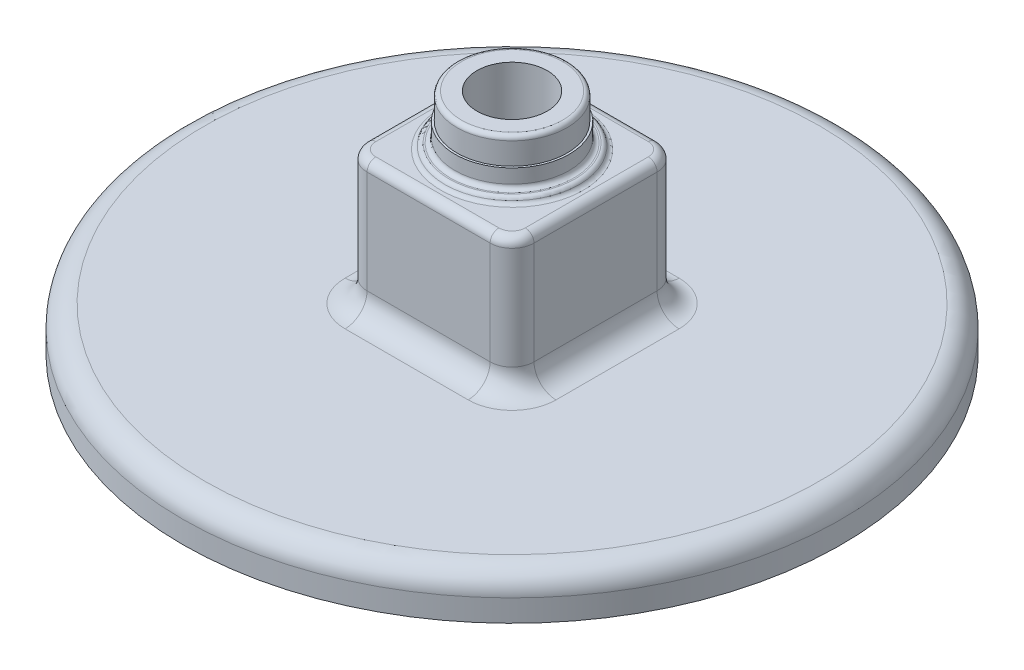
ISO-10303-21;
HEADER;
FILE_DESCRIPTION(('STEP AP214'),'2;1');
FILE_NAME('part.step','',(''),(''),'','','');
FILE_SCHEMA(('AUTOMOTIVE_DESIGN { 1 0 10303 214 1 1 1 1 }'));
ENDSEC;
DATA;
#1=APPLICATION_CONTEXT('core data for automotive mechanical design processes');
#2=APPLICATION_PROTOCOL_DEFINITION('international standard','automotive_design',2000,#1);
#3=PRODUCT_CONTEXT('',#1,'mechanical');
#4=PRODUCT('Part','Part','',(#3));
#5=PRODUCT_RELATED_PRODUCT_CATEGORY('part','',(#4));
#6=PRODUCT_DEFINITION_FORMATION('','',#4);
#7=PRODUCT_DEFINITION_CONTEXT('part definition',#1,'design');
#8=PRODUCT_DEFINITION('design','',#6,#7);
#9=PRODUCT_DEFINITION_SHAPE('','',#8);
#10=(LENGTH_UNIT() NAMED_UNIT(*) SI_UNIT(.MILLI.,.METRE.));
#11=(NAMED_UNIT(*) PLANE_ANGLE_UNIT() SI_UNIT($,.RADIAN.));
#12=(NAMED_UNIT(*) SI_UNIT($,.STERADIAN.) SOLID_ANGLE_UNIT());
#13=UNCERTAINTY_MEASURE_WITH_UNIT(LENGTH_MEASURE(1.E-05),#10,'distance_accuracy_value','');
#14=(GEOMETRIC_REPRESENTATION_CONTEXT(3) GLOBAL_UNCERTAINTY_ASSIGNED_CONTEXT((#13)) GLOBAL_UNIT_ASSIGNED_CONTEXT((#10,
#11,#12)) REPRESENTATION_CONTEXT('',''));
#15=CARTESIAN_POINT('',(0.,0.,0.));
#16=DIRECTION('',(0.,0.,1.));
#17=DIRECTION('',(1.,0.,0.));
#18=AXIS2_PLACEMENT_3D('',#15,#16,#17);
#19=CARTESIAN_POINT('',(19.,40.4,19.));
#20=DIRECTION('',(-1.,0.,0.));
#21=DIRECTION('',(0.,0.,1.));
#22=AXIS2_PLACEMENT_3D('',#19,#20,#21);
#23=PLANE('',#22);
#24=DIRECTION('',(0.,-1.,0.));
#25=VECTOR('',#24,1.);
#26=CARTESIAN_POINT('',(19.,40.4,-14.));
#27=LINE('',#26,#25);
#28=CARTESIAN_POINT('',(19.,15.,-14.));
#29=VERTEX_POINT('',#28);
#30=CARTESIAN_POINT('',(19.,38.4,-14.));
#31=VERTEX_POINT('',#30);
#32=EDGE_CURVE('E482',#29,#31,#27,.F.);
#33=ORIENTED_EDGE('',*,*,#32,.T.);
#34=DIRECTION('',(0.,0.,-1.));
#35=VECTOR('',#34,1.);
#36=CARTESIAN_POINT('',(19.,38.4,19.));
#37=LINE('',#36,#35);
#38=CARTESIAN_POINT('',(19.,38.4,14.));
#39=VERTEX_POINT('',#38);
#40=EDGE_CURVE('E266',#31,#39,#37,.F.);
#41=ORIENTED_EDGE('',*,*,#40,.T.);
#42=DIRECTION('',(0.,-1.,0.));
#43=VECTOR('',#42,1.);
#44=CARTESIAN_POINT('',(19.,40.4,14.));
#45=LINE('',#44,#43);
#46=CARTESIAN_POINT('',(19.,15.,14.));
#47=VERTEX_POINT('',#46);
#48=EDGE_CURVE('E480',#39,#47,#45,.T.);
#49=ORIENTED_EDGE('',*,*,#48,.T.);
#50=DIRECTION('',(0.,0.,-1.));
#51=VECTOR('',#50,1.);
#52=CARTESIAN_POINT('',(19.,15.,19.));
#53=LINE('',#52,#51);
#54=EDGE_CURVE('E217',#47,#29,#53,.T.);
#55=ORIENTED_EDGE('',*,*,#54,.T.);
#56=EDGE_LOOP('',(#33,#41,#49,#55));
#57=FACE_BOUND('',#56,.T.);
#58=ADVANCED_FACE('F40',(#57),#23,.F.);
#59=CARTESIAN_POINT('',(-19.,40.4,-19.));
#60=DIRECTION('',(0.,0.,1.));
#61=DIRECTION('',(1.,0.,0.));
#62=AXIS2_PLACEMENT_3D('',#59,#60,#61);
#63=PLANE('',#62);
#64=DIRECTION('',(0.,-1.,0.));
#65=VECTOR('',#64,1.);
#66=CARTESIAN_POINT('',(-14.,40.4,-19.));
#67=LINE('',#66,#65);
#68=CARTESIAN_POINT('',(-14.,15.,-19.));
#69=VERTEX_POINT('',#68);
#70=CARTESIAN_POINT('',(-14.,38.4,-19.));
#71=VERTEX_POINT('',#70);
#72=EDGE_CURVE('E477',#69,#71,#67,.F.);
#73=ORIENTED_EDGE('',*,*,#72,.T.);
#74=DIRECTION('',(-1.,0.,0.));
#75=VECTOR('',#74,1.);
#76=CARTESIAN_POINT('',(-19.,38.4,-19.));
#77=LINE('',#76,#75);
#78=CARTESIAN_POINT('',(14.,38.4,-19.));
#79=VERTEX_POINT('',#78);
#80=EDGE_CURVE('E63',#71,#79,#77,.F.);
#81=ORIENTED_EDGE('',*,*,#80,.T.);
#82=DIRECTION('',(0.,-1.,0.));
#83=VECTOR('',#82,1.);
#84=CARTESIAN_POINT('',(14.,40.4,-19.));
#85=LINE('',#84,#83);
#86=CARTESIAN_POINT('',(14.,15.,-19.));
#87=VERTEX_POINT('',#86);
#88=EDGE_CURVE('E460',#79,#87,#85,.T.);
#89=ORIENTED_EDGE('',*,*,#88,.T.);
#90=DIRECTION('',(-1.,0.,0.));
#91=VECTOR('',#90,1.);
#92=CARTESIAN_POINT('',(-19.,15.,-19.));
#93=LINE('',#92,#91);
#94=EDGE_CURVE('E214',#87,#69,#93,.T.);
#95=ORIENTED_EDGE('',*,*,#94,.T.);
#96=EDGE_LOOP('',(#73,#81,#89,#95));
#97=FACE_BOUND('',#96,.T.);
#98=ADVANCED_FACE('F317',(#97),#63,.F.);
#99=CARTESIAN_POINT('',(-19.,40.4,19.));
#100=DIRECTION('',(1.,0.,0.));
#101=DIRECTION('',(0.,0.,-1.));
#102=AXIS2_PLACEMENT_3D('',#99,#100,#101);
#103=PLANE('',#102);
#104=DIRECTION('',(0.,-1.,0.));
#105=VECTOR('',#104,1.);
#106=CARTESIAN_POINT('',(-19.,40.4,14.));
#107=LINE('',#106,#105);
#108=CARTESIAN_POINT('',(-19.,15.,14.));
#109=VERTEX_POINT('',#108);
#110=CARTESIAN_POINT('',(-19.,38.4,14.));
#111=VERTEX_POINT('',#110);
#112=EDGE_CURVE('E455',#109,#111,#107,.F.);
#113=ORIENTED_EDGE('',*,*,#112,.T.);
#114=DIRECTION('',(0.,0.,1.));
#115=VECTOR('',#114,1.);
#116=CARTESIAN_POINT('',(-19.,38.4,19.));
#117=LINE('',#116,#115);
#118=CARTESIAN_POINT('',(-19.,38.4,-14.));
#119=VERTEX_POINT('',#118);
#120=EDGE_CURVE('E260',#111,#119,#117,.F.);
#121=ORIENTED_EDGE('',*,*,#120,.T.);
#122=DIRECTION('',(0.,-1.,0.));
#123=VECTOR('',#122,1.);
#124=CARTESIAN_POINT('',(-19.,40.4,-14.));
#125=LINE('',#124,#123);
#126=CARTESIAN_POINT('',(-19.,15.,-14.));
#127=VERTEX_POINT('',#126);
#128=EDGE_CURVE('E461',#119,#127,#125,.T.);
#129=ORIENTED_EDGE('',*,*,#128,.T.);
#130=DIRECTION('',(0.,0.,1.));
#131=VECTOR('',#130,1.);
#132=CARTESIAN_POINT('',(-19.,15.,19.));
#133=LINE('',#132,#131);
#134=EDGE_CURVE('E209',#127,#109,#133,.T.);
#135=ORIENTED_EDGE('',*,*,#134,.T.);
#136=EDGE_LOOP('',(#113,#121,#129,#135));
#137=FACE_BOUND('',#136,.T.);
#138=ADVANCED_FACE('F323',(#137),#103,.F.);
#139=CARTESIAN_POINT('',(-19.,40.4,19.));
#140=DIRECTION('',(0.,0.,-1.));
#141=DIRECTION('',(-1.,0.,0.));
#142=AXIS2_PLACEMENT_3D('',#139,#140,#141);
#143=PLANE('',#142);
#144=DIRECTION('',(0.,-1.,0.));
#145=VECTOR('',#144,1.);
#146=CARTESIAN_POINT('',(14.,40.4,19.));
#147=LINE('',#146,#145);
#148=CARTESIAN_POINT('',(14.,15.,19.));
#149=VERTEX_POINT('',#148);
#150=CARTESIAN_POINT('',(14.,38.4,19.));
#151=VERTEX_POINT('',#150);
#152=EDGE_CURVE('E500',#149,#151,#147,.F.);
#153=ORIENTED_EDGE('',*,*,#152,.T.);
#154=DIRECTION('',(1.,0.,0.));
#155=VECTOR('',#154,1.);
#156=CARTESIAN_POINT('',(-19.,38.4,19.));
#157=LINE('',#156,#155);
#158=CARTESIAN_POINT('',(-14.,38.4,19.));
#159=VERTEX_POINT('',#158);
#160=EDGE_CURVE('E256',#151,#159,#157,.F.);
#161=ORIENTED_EDGE('',*,*,#160,.T.);
#162=DIRECTION('',(0.,-1.,0.));
#163=VECTOR('',#162,1.);
#164=CARTESIAN_POINT('',(-14.,40.4,19.));
#165=LINE('',#164,#163);
#166=CARTESIAN_POINT('',(-14.,15.,19.));
#167=VERTEX_POINT('',#166);
#168=EDGE_CURVE('E504',#159,#167,#165,.T.);
#169=ORIENTED_EDGE('',*,*,#168,.T.);
#170=DIRECTION('',(1.,0.,0.));
#171=VECTOR('',#170,1.);
#172=CARTESIAN_POINT('',(-19.,15.,19.));
#173=LINE('',#172,#171);
#174=EDGE_CURVE('E204',#167,#149,#173,.T.);
#175=ORIENTED_EDGE('',*,*,#174,.T.);
#176=EDGE_LOOP('',(#153,#161,#169,#175));
#177=FACE_BOUND('',#176,.T.);
#178=ADVANCED_FACE('F442',(#177),#143,.F.);
#179=CARTESIAN_POINT('',(0.,40.4,0.));
#180=DIRECTION('',(0.,-1.,0.));
#181=DIRECTION('',(0.,0.,-1.));
#182=AXIS2_PLACEMENT_3D('',#179,#180,#181);
#183=PLANE('',#182);
#184=CARTESIAN_POINT('',(0.,40.4,0.));
#185=DIRECTION('',(0.,-1.,0.));
#186=DIRECTION('',(0.,0.,-1.));
#187=AXIS2_PLACEMENT_3D('',#184,#185,#186);
#188=CIRCLE('',#187,16.2);
#189=CARTESIAN_POINT('',(0.,40.4,-16.2));
#190=VERTEX_POINT('',#189);
#191=EDGE_CURVE('E301',#190,#190,#188,.T.);
#192=ORIENTED_EDGE('',*,*,#191,.T.);
#193=EDGE_LOOP('',(#192));
#194=FACE_BOUND('',#193,.T.);
#195=DIRECTION('',(1.,0.,0.));
#196=VECTOR('',#195,1.);
#197=CARTESIAN_POINT('',(0.,40.4,17.));
#198=LINE('',#197,#196);
#199=CARTESIAN_POINT('',(-14.,40.4,17.));
#200=VERTEX_POINT('',#199);
#201=CARTESIAN_POINT('',(14.,40.4,17.));
#202=VERTEX_POINT('',#201);
#203=EDGE_CURVE('E248',#200,#202,#198,.T.);
#204=ORIENTED_EDGE('',*,*,#203,.T.);
#205=CARTESIAN_POINT('',(14.,40.4,14.));
#206=DIRECTION('',(0.,-1.,0.));
#207=DIRECTION('',(0.,0.,-1.));
#208=AXIS2_PLACEMENT_3D('',#205,#206,#207);
#209=CIRCLE('',#208,3.);
#210=CARTESIAN_POINT('',(17.,40.4,14.));
#211=VERTEX_POINT('',#210);
#212=EDGE_CURVE('E250',#202,#211,#209,.F.);
#213=ORIENTED_EDGE('',*,*,#212,.T.);
#214=DIRECTION('',(0.,0.,-1.));
#215=VECTOR('',#214,1.);
#216=CARTESIAN_POINT('',(17.,40.4,0.));
#217=LINE('',#216,#215);
#218=CARTESIAN_POINT('',(17.,40.4,-14.));
#219=VERTEX_POINT('',#218);
#220=EDGE_CURVE('E219',#211,#219,#217,.T.);
#221=ORIENTED_EDGE('',*,*,#220,.T.);
#222=CARTESIAN_POINT('',(14.,40.4,-14.));
#223=DIRECTION('',(0.,-1.,0.));
#224=DIRECTION('',(0.,0.,-1.));
#225=AXIS2_PLACEMENT_3D('',#222,#223,#224);
#226=CIRCLE('',#225,3.);
#227=CARTESIAN_POINT('',(14.,40.4,-17.));
#228=VERTEX_POINT('',#227);
#229=EDGE_CURVE('E238',#219,#228,#226,.F.);
#230=ORIENTED_EDGE('',*,*,#229,.T.);
#231=DIRECTION('',(-1.,0.,0.));
#232=VECTOR('',#231,1.);
#233=CARTESIAN_POINT('',(0.,40.4,-17.));
#234=LINE('',#233,#232);
#235=CARTESIAN_POINT('',(-14.,40.4,-17.));
#236=VERTEX_POINT('',#235);
#237=EDGE_CURVE('E240',#228,#236,#234,.T.);
#238=ORIENTED_EDGE('',*,*,#237,.T.);
#239=CARTESIAN_POINT('',(-14.,40.4,-14.));
#240=DIRECTION('',(0.,-1.,0.));
#241=DIRECTION('',(0.,0.,-1.));
#242=AXIS2_PLACEMENT_3D('',#239,#240,#241);
#243=CIRCLE('',#242,3.);
#244=CARTESIAN_POINT('',(-17.,40.4,-14.));
#245=VERTEX_POINT('',#244);
#246=EDGE_CURVE('E242',#236,#245,#243,.F.);
#247=ORIENTED_EDGE('',*,*,#246,.T.);
#248=DIRECTION('',(0.,0.,1.));
#249=VECTOR('',#248,1.);
#250=CARTESIAN_POINT('',(-17.,40.4,0.));
#251=LINE('',#250,#249);
#252=CARTESIAN_POINT('',(-17.,40.4,14.));
#253=VERTEX_POINT('',#252);
#254=EDGE_CURVE('E244',#245,#253,#251,.T.);
#255=ORIENTED_EDGE('',*,*,#254,.T.);
#256=CARTESIAN_POINT('',(-14.,40.4,14.));
#257=DIRECTION('',(0.,-1.,0.));
#258=DIRECTION('',(0.,0.,-1.));
#259=AXIS2_PLACEMENT_3D('',#256,#257,#258);
#260=CIRCLE('',#259,3.);
#261=EDGE_CURVE('E246',#253,#200,#260,.F.);
#262=ORIENTED_EDGE('',*,*,#261,.T.);
#263=EDGE_LOOP('',(#204,#213,#221,#230,#238,#247,#255,#262));
#264=FACE_BOUND('',#263,.T.);
#265=ADVANCED_FACE('F436',(#194,#264),#183,.F.);
#266=CARTESIAN_POINT('',(0.,10.,0.));
#267=DIRECTION('',(0.,1.,0.));
#268=DIRECTION('',(0.,0.,1.));
#269=AXIS2_PLACEMENT_3D('',#266,#267,#268);
#270=PLANE('',#269);
#271=DIRECTION('',(0.,0.,-1.));
#272=VECTOR('',#271,1.);
#273=CARTESIAN_POINT('',(24.,10.,0.));
#274=LINE('',#273,#272);
#275=CARTESIAN_POINT('',(24.,10.,-14.));
#276=VERTEX_POINT('',#275);
#277=CARTESIAN_POINT('',(24.,10.,14.));
#278=VERTEX_POINT('',#277);
#279=EDGE_CURVE('E160',#276,#278,#274,.F.);
#280=ORIENTED_EDGE('',*,*,#279,.T.);
#281=CARTESIAN_POINT('',(14.,10.,14.));
#282=DIRECTION('',(0.,1.,0.));
#283=DIRECTION('',(0.,0.,1.));
#284=AXIS2_PLACEMENT_3D('',#281,#282,#283);
#285=CIRCLE('',#284,10.);
#286=CARTESIAN_POINT('',(14.,10.,24.));
#287=VERTEX_POINT('',#286);
#288=EDGE_CURVE('E199',#278,#287,#285,.F.);
#289=ORIENTED_EDGE('',*,*,#288,.T.);
#290=DIRECTION('',(1.,0.,0.));
#291=VECTOR('',#290,1.);
#292=CARTESIAN_POINT('',(0.,10.,24.));
#293=LINE('',#292,#291);
#294=CARTESIAN_POINT('',(-14.,10.,24.));
#295=VERTEX_POINT('',#294);
#296=EDGE_CURVE('E197',#287,#295,#293,.F.);
#297=ORIENTED_EDGE('',*,*,#296,.T.);
#298=CARTESIAN_POINT('',(-14.,10.,14.));
#299=DIRECTION('',(0.,1.,0.));
#300=DIRECTION('',(0.,0.,1.));
#301=AXIS2_PLACEMENT_3D('',#298,#299,#300);
#302=CIRCLE('',#301,10.);
#303=CARTESIAN_POINT('',(-24.,10.,14.));
#304=VERTEX_POINT('',#303);
#305=EDGE_CURVE('E195',#295,#304,#302,.F.);
#306=ORIENTED_EDGE('',*,*,#305,.T.);
#307=DIRECTION('',(0.,0.,1.));
#308=VECTOR('',#307,1.);
#309=CARTESIAN_POINT('',(-24.,10.,0.));
#310=LINE('',#309,#308);
#311=CARTESIAN_POINT('',(-24.,10.,-14.));
#312=VERTEX_POINT('',#311);
#313=EDGE_CURVE('E193',#304,#312,#310,.F.);
#314=ORIENTED_EDGE('',*,*,#313,.T.);
#315=CARTESIAN_POINT('',(-14.,10.,-14.));
#316=DIRECTION('',(0.,1.,0.));
#317=DIRECTION('',(0.,0.,1.));
#318=AXIS2_PLACEMENT_3D('',#315,#316,#317);
#319=CIRCLE('',#318,10.);
#320=CARTESIAN_POINT('',(-14.,10.,-24.));
#321=VERTEX_POINT('',#320);
#322=EDGE_CURVE('E191',#312,#321,#319,.F.);
#323=ORIENTED_EDGE('',*,*,#322,.T.);
#324=DIRECTION('',(-1.,0.,0.));
#325=VECTOR('',#324,1.);
#326=CARTESIAN_POINT('',(0.,10.,-24.));
#327=LINE('',#326,#325);
#328=CARTESIAN_POINT('',(14.,10.,-24.));
#329=VERTEX_POINT('',#328);
#330=EDGE_CURVE('E163',#321,#329,#327,.F.);
#331=ORIENTED_EDGE('',*,*,#330,.T.);
#332=CARTESIAN_POINT('',(14.,10.,-14.));
#333=DIRECTION('',(0.,1.,0.));
#334=DIRECTION('',(0.,0.,1.));
#335=AXIS2_PLACEMENT_3D('',#332,#333,#334);
#336=CIRCLE('',#335,10.);
#337=EDGE_CURVE('E154',#329,#276,#336,.F.);
#338=ORIENTED_EDGE('',*,*,#337,.T.);
#339=EDGE_LOOP('',(#280,#289,#297,#306,#314,#323,#331,#338));
#340=FACE_BOUND('',#339,.T.);
#341=CARTESIAN_POINT('',(0.,10.,0.));
#342=DIRECTION('',(0.,1.,0.));
#343=DIRECTION('',(0.,0.,1.));
#344=AXIS2_PLACEMENT_3D('',#341,#342,#343);
#345=CIRCLE('',#344,70.);
#346=CARTESIAN_POINT('',(0.,10.,70.));
#347=VERTEX_POINT('',#346);
#348=EDGE_CURVE('E186',#347,#347,#345,.T.);
#349=ORIENTED_EDGE('',*,*,#348,.T.);
#350=EDGE_LOOP('',(#349));
#351=FACE_BOUND('',#350,.T.);
#352=ADVANCED_FACE('F156',(#340,#351),#270,.T.);
#353=CARTESIAN_POINT('',(0.,10.,0.));
#354=DIRECTION('',(0.,-1.,0.));
#355=DIRECTION('',(0.,0.,-1.));
#356=AXIS2_PLACEMENT_3D('',#353,#354,#355);
#357=CYLINDRICAL_SURFACE('',#356,75.);
#358=CARTESIAN_POINT('',(0.,5.,0.));
#359=DIRECTION('',(0.,1.,0.));
#360=DIRECTION('',(0.,0.,1.));
#361=AXIS2_PLACEMENT_3D('',#358,#359,#360);
#362=CIRCLE('',#361,75.);
#363=CARTESIAN_POINT('',(0.,5.,75.));
#364=VERTEX_POINT('',#363);
#365=EDGE_CURVE('E183',#364,#364,#362,.F.);
#366=ORIENTED_EDGE('',*,*,#365,.T.);
#367=EDGE_LOOP('',(#366));
#368=FACE_BOUND('',#367,.T.);
#369=CARTESIAN_POINT('',(0.,0.,0.));
#370=DIRECTION('',(0.,1.,0.));
#371=DIRECTION('',(0.,0.,1.));
#372=AXIS2_PLACEMENT_3D('',#369,#370,#371);
#373=CIRCLE('',#372,75.);
#374=CARTESIAN_POINT('',(0.,0.,75.));
#375=VERTEX_POINT('',#374);
#376=EDGE_CURVE('E505',#375,#375,#373,.T.);
#377=ORIENTED_EDGE('',*,*,#376,.T.);
#378=EDGE_LOOP('',(#377));
#379=FACE_BOUND('',#378,.T.);
#380=ADVANCED_FACE('F435',(#368,#379),#357,.T.);
#381=CARTESIAN_POINT('',(0.,0.,0.));
#382=DIRECTION('',(0.,-1.,0.));
#383=DIRECTION('',(0.,0.,-1.));
#384=AXIS2_PLACEMENT_3D('',#381,#382,#383);
#385=PLANE('',#384);
#386=CARTESIAN_POINT('',(0.,0.,0.));
#387=DIRECTION('',(0.,-1.,0.));
#388=DIRECTION('',(0.,0.,-1.));
#389=AXIS2_PLACEMENT_3D('',#386,#387,#388);
#390=CIRCLE('',#389,4.00000000000001);
#391=CARTESIAN_POINT('',(0.,0.,-4.00000000000001));
#392=VERTEX_POINT('',#391);
#393=EDGE_CURVE('E527',#392,#392,#390,.T.);
#394=ORIENTED_EDGE('',*,*,#393,.F.);
#395=EDGE_LOOP('',(#394));
#396=FACE_BOUND('',#395,.T.);
#397=ORIENTED_EDGE('',*,*,#376,.F.);
#398=EDGE_LOOP('',(#397));
#399=FACE_BOUND('',#398,.T.);
#400=ADVANCED_FACE('F331',(#396,#399),#385,.T.);
#401=CARTESIAN_POINT('',(-14.,40.4,14.));
#402=DIRECTION('',(0.,-1.,0.));
#403=DIRECTION('',(0.,0.,-1.));
#404=AXIS2_PLACEMENT_3D('',#401,#402,#403);
#405=CYLINDRICAL_SURFACE('',#404,5.);
#406=ORIENTED_EDGE('',*,*,#168,.F.);
#407=CARTESIAN_POINT('',(-14.,38.4,14.));
#408=DIRECTION('',(0.,-1.,0.));
#409=DIRECTION('',(0.,0.,-1.));
#410=AXIS2_PLACEMENT_3D('',#407,#408,#409);
#411=CIRCLE('',#410,5.);
#412=EDGE_CURVE('E258',#159,#111,#411,.T.);
#413=ORIENTED_EDGE('',*,*,#412,.T.);
#414=ORIENTED_EDGE('',*,*,#112,.F.);
#415=CARTESIAN_POINT('',(-14.,15.,14.));
#416=DIRECTION('',(0.,1.,0.));
#417=DIRECTION('',(0.,0.,1.));
#418=AXIS2_PLACEMENT_3D('',#415,#416,#417);
#419=CIRCLE('',#418,5.);
#420=EDGE_CURVE('E206',#109,#167,#419,.T.);
#421=ORIENTED_EDGE('',*,*,#420,.T.);
#422=EDGE_LOOP('',(#406,#413,#414,#421));
#423=FACE_BOUND('',#422,.T.);
#424=ADVANCED_FACE('F327',(#423),#405,.T.);
#425=CARTESIAN_POINT('',(-14.,40.4,-14.));
#426=DIRECTION('',(0.,-1.,0.));
#427=DIRECTION('',(0.,0.,-1.));
#428=AXIS2_PLACEMENT_3D('',#425,#426,#427);
#429=CYLINDRICAL_SURFACE('',#428,5.);
#430=ORIENTED_EDGE('',*,*,#128,.F.);
#431=CARTESIAN_POINT('',(-14.,38.4,-14.));
#432=DIRECTION('',(0.,-1.,0.));
#433=DIRECTION('',(0.,0.,-1.));
#434=AXIS2_PLACEMENT_3D('',#431,#432,#433);
#435=CIRCLE('',#434,5.);
#436=EDGE_CURVE('E262',#119,#71,#435,.T.);
#437=ORIENTED_EDGE('',*,*,#436,.T.);
#438=ORIENTED_EDGE('',*,*,#72,.F.);
#439=CARTESIAN_POINT('',(-14.,15.,-14.));
#440=DIRECTION('',(0.,1.,0.));
#441=DIRECTION('',(0.,0.,1.));
#442=AXIS2_PLACEMENT_3D('',#439,#440,#441);
#443=CIRCLE('',#442,5.);
#444=EDGE_CURVE('E211',#69,#127,#443,.T.);
#445=ORIENTED_EDGE('',*,*,#444,.T.);
#446=EDGE_LOOP('',(#430,#437,#438,#445));
#447=FACE_BOUND('',#446,.T.);
#448=ADVANCED_FACE('F330',(#447),#429,.T.);
#449=CARTESIAN_POINT('',(14.,40.4,-14.));
#450=DIRECTION('',(0.,-1.,0.));
#451=DIRECTION('',(0.,0.,-1.));
#452=AXIS2_PLACEMENT_3D('',#449,#450,#451);
#453=CYLINDRICAL_SURFACE('',#452,5.);
#454=ORIENTED_EDGE('',*,*,#88,.F.);
#455=CARTESIAN_POINT('',(14.,38.4,-14.));
#456=DIRECTION('',(0.,-1.,0.));
#457=DIRECTION('',(0.,0.,-1.));
#458=AXIS2_PLACEMENT_3D('',#455,#456,#457);
#459=CIRCLE('',#458,5.);
#460=EDGE_CURVE('E55',#79,#31,#459,.T.);
#461=ORIENTED_EDGE('',*,*,#460,.T.);
#462=ORIENTED_EDGE('',*,*,#32,.F.);
#463=CARTESIAN_POINT('',(14.,15.,-14.));
#464=DIRECTION('',(0.,1.,0.));
#465=DIRECTION('',(0.,0.,1.));
#466=AXIS2_PLACEMENT_3D('',#463,#464,#465);
#467=CIRCLE('',#466,5.);
#468=EDGE_CURVE('E173',#29,#87,#467,.T.);
#469=ORIENTED_EDGE('',*,*,#468,.T.);
#470=EDGE_LOOP('',(#454,#461,#462,#469));
#471=FACE_BOUND('',#470,.T.);
#472=ADVANCED_FACE('F335',(#471),#453,.T.);
#473=CARTESIAN_POINT('',(14.,40.4,14.));
#474=DIRECTION('',(0.,-1.,0.));
#475=DIRECTION('',(0.,0.,-1.));
#476=AXIS2_PLACEMENT_3D('',#473,#474,#475);
#477=CYLINDRICAL_SURFACE('',#476,5.);
#478=ORIENTED_EDGE('',*,*,#48,.F.);
#479=CARTESIAN_POINT('',(14.,38.4,14.));
#480=DIRECTION('',(0.,-1.,0.));
#481=DIRECTION('',(0.,0.,-1.));
#482=AXIS2_PLACEMENT_3D('',#479,#480,#481);
#483=CIRCLE('',#482,5.);
#484=EDGE_CURVE('E253',#39,#151,#483,.T.);
#485=ORIENTED_EDGE('',*,*,#484,.T.);
#486=ORIENTED_EDGE('',*,*,#152,.F.);
#487=CARTESIAN_POINT('',(14.,15.,14.));
#488=DIRECTION('',(0.,1.,0.));
#489=DIRECTION('',(0.,0.,1.));
#490=AXIS2_PLACEMENT_3D('',#487,#488,#489);
#491=CIRCLE('',#490,5.);
#492=EDGE_CURVE('E201',#149,#47,#491,.T.);
#493=ORIENTED_EDGE('',*,*,#492,.T.);
#494=EDGE_LOOP('',(#478,#485,#486,#493));
#495=FACE_BOUND('',#494,.T.);
#496=ADVANCED_FACE('F339',(#495),#477,.T.);
#497=CARTESIAN_POINT('',(0.,41.7,-13.));
#498=DIRECTION('',(0.,1.,0.));
#499=DIRECTION('',(0.,0.,1.));
#500=AXIS2_PLACEMENT_3D('',#497,#498,#499);
#501=PLANE('',#500);
#502=CARTESIAN_POINT('',(0.,41.7,0.));
#503=DIRECTION('',(0.,1.,0.));
#504=DIRECTION('',(0.,0.,1.));
#505=AXIS2_PLACEMENT_3D('',#502,#503,#504);
#506=CIRCLE('',#505,14.3265006004805);
#507=CARTESIAN_POINT('',(0.,41.7,14.3265006004805));
#508=VERTEX_POINT('',#507);
#509=EDGE_CURVE('E12',#508,#508,#506,.T.);
#510=ORIENTED_EDGE('',*,*,#509,.T.);
#511=EDGE_LOOP('',(#510));
#512=FACE_BOUND('',#511,.T.);
#513=CARTESIAN_POINT('',(0.,41.7,0.));
#514=DIRECTION('',(0.,1.,0.));
#515=DIRECTION('',(0.,0.,1.));
#516=AXIS2_PLACEMENT_3D('',#513,#514,#515);
#517=CIRCLE('',#516,14.);
#518=CARTESIAN_POINT('',(0.,41.7,14.));
#519=VERTEX_POINT('',#518);
#520=EDGE_CURVE('E295',#519,#519,#517,.F.);
#521=ORIENTED_EDGE('',*,*,#520,.T.);
#522=EDGE_LOOP('',(#521));
#523=FACE_BOUND('',#522,.T.);
#524=ADVANCED_FACE('F342',(#512,#523),#501,.T.);
#525=CARTESIAN_POINT('',(0.,0.,0.));
#526=DIRECTION('',(0.,-1.,0.));
#527=DIRECTION('',(0.,0.,-1.));
#528=AXIS2_PLACEMENT_3D('',#525,#526,#527);
#529=CYLINDRICAL_SURFACE('',#528,13.);
#530=CARTESIAN_POINT('',(0.,42.7,0.));
#531=DIRECTION('',(0.,1.,0.));
#532=DIRECTION('',(0.,0.,1.));
#533=AXIS2_PLACEMENT_3D('',#530,#531,#532);
#534=CIRCLE('',#533,13.);
#535=CARTESIAN_POINT('',(0.,42.7,13.));
#536=VERTEX_POINT('',#535);
#537=EDGE_CURVE('E298',#536,#536,#534,.T.);
#538=ORIENTED_EDGE('',*,*,#537,.T.);
#539=EDGE_LOOP('',(#538));
#540=FACE_BOUND('',#539,.T.);
#541=CARTESIAN_POINT('',(0.,45.9,0.));
#542=DIRECTION('',(0.,-1.,0.));
#543=DIRECTION('',(0.,0.,-1.));
#544=AXIS2_PLACEMENT_3D('',#541,#542,#543);
#545=CIRCLE('',#544,13.);
#546=CARTESIAN_POINT('',(0.,45.9,-13.));
#547=VERTEX_POINT('',#546);
#548=EDGE_CURVE('E509',#547,#547,#545,.T.);
#549=ORIENTED_EDGE('',*,*,#548,.T.);
#550=EDGE_LOOP('',(#549));
#551=FACE_BOUND('',#550,.T.);
#552=ADVANCED_FACE('F422',(#540,#551),#529,.T.);
#553=CARTESIAN_POINT('',(0.,45.9,-12.525));
#554=DIRECTION('',(0.,1.,0.));
#555=DIRECTION('',(0.,0.,1.));
#556=AXIS2_PLACEMENT_3D('',#553,#554,#555);
#557=PLANE('',#556);
#558=CARTESIAN_POINT('',(0.,45.9,0.));
#559=DIRECTION('',(0.,-1.,0.));
#560=DIRECTION('',(0.,0.,-1.));
#561=AXIS2_PLACEMENT_3D('',#558,#559,#560);
#562=CIRCLE('',#561,12.525);
#563=CARTESIAN_POINT('',(0.,45.9,-12.525));
#564=VERTEX_POINT('',#563);
#565=EDGE_CURVE('E524',#564,#564,#562,.T.);
#566=ORIENTED_EDGE('',*,*,#565,.T.);
#567=EDGE_LOOP('',(#566));
#568=FACE_BOUND('',#567,.T.);
#569=ORIENTED_EDGE('',*,*,#548,.F.);
#570=EDGE_LOOP('',(#569));
#571=FACE_BOUND('',#570,.T.);
#572=ADVANCED_FACE('F428',(#568,#571),#557,.T.);
#573=CARTESIAN_POINT('',(0.,0.,0.));
#574=DIRECTION('',(0.,-1.,0.));
#575=DIRECTION('',(0.,0.,-1.));
#576=AXIS2_PLACEMENT_3D('',#573,#574,#575);
#577=CYLINDRICAL_SURFACE('',#576,12.525);
#578=CARTESIAN_POINT('',(0.,50.9,0.));
#579=DIRECTION('',(0.,1.,0.));
#580=DIRECTION('',(0.,0.,1.));
#581=AXIS2_PLACEMENT_3D('',#578,#579,#580);
#582=CIRCLE('',#581,12.525);
#583=CARTESIAN_POINT('',(0.,50.9,12.525));
#584=VERTEX_POINT('',#583);
#585=EDGE_CURVE('E268',#584,#584,#582,.F.);
#586=ORIENTED_EDGE('',*,*,#585,.T.);
#587=EDGE_LOOP('',(#586));
#588=FACE_BOUND('',#587,.T.);
#589=ORIENTED_EDGE('',*,*,#565,.F.);
#590=EDGE_LOOP('',(#589));
#591=FACE_BOUND('',#590,.T.);
#592=ADVANCED_FACE('F581',(#588,#591),#577,.T.);
#593=CARTESIAN_POINT('',(0.,51.9,0.));
#594=DIRECTION('',(0.,1.,0.));
#595=DIRECTION('',(0.,0.,1.));
#596=AXIS2_PLACEMENT_3D('',#593,#594,#595);
#597=PLANE('',#596);
#598=CARTESIAN_POINT('',(0.,51.9,0.));
#599=DIRECTION('',(0.,1.,0.));
#600=DIRECTION('',(0.,0.,1.));
#601=AXIS2_PLACEMENT_3D('',#598,#599,#600);
#602=CIRCLE('',#601,11.525);
#603=CARTESIAN_POINT('',(0.,51.9,11.525));
#604=VERTEX_POINT('',#603);
#605=EDGE_CURVE('E292',#604,#604,#602,.T.);
#606=ORIENTED_EDGE('',*,*,#605,.T.);
#607=EDGE_LOOP('',(#606));
#608=FACE_BOUND('',#607,.T.);
#609=CARTESIAN_POINT('',(0.,51.9,0.));
#610=DIRECTION('',(0.,-1.,0.));
#611=DIRECTION('',(0.,0.,-1.));
#612=AXIS2_PLACEMENT_3D('',#609,#610,#611);
#613=CIRCLE('',#612,8.);
#614=CARTESIAN_POINT('',(0.,51.9,-8.));
#615=VERTEX_POINT('',#614);
#616=EDGE_CURVE('E236',#615,#615,#613,.T.);
#617=ORIENTED_EDGE('',*,*,#616,.T.);
#618=EDGE_LOOP('',(#617));
#619=FACE_BOUND('',#618,.T.);
#620=ADVANCED_FACE('F545',(#608,#619),#597,.T.);
#621=CARTESIAN_POINT('',(0.,0.,0.));
#622=DIRECTION('',(0.,-1.,0.));
#623=DIRECTION('',(0.,0.,-1.));
#624=AXIS2_PLACEMENT_3D('',#621,#622,#623);
#625=CYLINDRICAL_SURFACE('',#624,4.00000000000001);
#626=CARTESIAN_POINT('',(0.,16.9,0.));
#627=DIRECTION('',(0.,-1.,0.));
#628=DIRECTION('',(0.,0.,-1.));
#629=AXIS2_PLACEMENT_3D('',#626,#627,#628);
#630=CIRCLE('',#629,4.);
#631=CARTESIAN_POINT('',(0.,16.9,-4.));
#632=VERTEX_POINT('',#631);
#633=EDGE_CURVE('E530',#632,#632,#630,.T.);
#634=ORIENTED_EDGE('',*,*,#633,.F.);
#635=EDGE_LOOP('',(#634));
#636=FACE_BOUND('',#635,.T.);
#637=ORIENTED_EDGE('',*,*,#393,.T.);
#638=EDGE_LOOP('',(#637));
#639=FACE_BOUND('',#638,.T.);
#640=ADVANCED_FACE('F567',(#636,#639),#625,.F.);
#641=CARTESIAN_POINT('',(0.,16.9,-1.75));
#642=DIRECTION('',(0.,1.,0.));
#643=DIRECTION('',(0.,0.,1.));
#644=AXIS2_PLACEMENT_3D('',#641,#642,#643);
#645=PLANE('',#644);
#646=CARTESIAN_POINT('',(0.,16.9,0.));
#647=DIRECTION('',(0.,-1.,0.));
#648=DIRECTION('',(0.,0.,-1.));
#649=AXIS2_PLACEMENT_3D('',#646,#647,#648);
#650=CIRCLE('',#649,1.75);
#651=CARTESIAN_POINT('',(0.,16.9,-1.75));
#652=VERTEX_POINT('',#651);
#653=EDGE_CURVE('E533',#652,#652,#650,.T.);
#654=ORIENTED_EDGE('',*,*,#653,.F.);
#655=EDGE_LOOP('',(#654));
#656=FACE_BOUND('',#655,.T.);
#657=ORIENTED_EDGE('',*,*,#633,.T.);
#658=EDGE_LOOP('',(#657));
#659=FACE_BOUND('',#658,.T.);
#660=ADVANCED_FACE('F561',(#656,#659),#645,.F.);
#661=CARTESIAN_POINT('',(0.,0.,0.));
#662=DIRECTION('',(0.,-1.,0.));
#663=DIRECTION('',(0.,0.,-1.));
#664=AXIS2_PLACEMENT_3D('',#661,#662,#663);
#665=CYLINDRICAL_SURFACE('',#664,1.75);
#666=CARTESIAN_POINT('',(0.,26.9,0.));
#667=DIRECTION('',(0.,-1.,0.));
#668=DIRECTION('',(0.,0.,-1.));
#669=AXIS2_PLACEMENT_3D('',#666,#667,#668);
#670=CIRCLE('',#669,1.75);
#671=CARTESIAN_POINT('',(0.,26.9,-1.75));
#672=VERTEX_POINT('',#671);
#673=EDGE_CURVE('E536',#672,#672,#670,.T.);
#674=ORIENTED_EDGE('',*,*,#673,.F.);
#675=EDGE_LOOP('',(#674));
#676=FACE_BOUND('',#675,.T.);
#677=ORIENTED_EDGE('',*,*,#653,.T.);
#678=EDGE_LOOP('',(#677));
#679=FACE_BOUND('',#678,.T.);
#680=ADVANCED_FACE('F555',(#676,#679),#665,.F.);
#681=CARTESIAN_POINT('',(0.,26.9,-1.75));
#682=DIRECTION('',(0.,-1.,0.));
#683=DIRECTION('',(0.,0.,-1.));
#684=AXIS2_PLACEMENT_3D('',#681,#682,#683);
#685=PLANE('',#684);
#686=CARTESIAN_POINT('',(0.,26.9,0.));
#687=DIRECTION('',(0.,-1.,0.));
#688=DIRECTION('',(0.,0.,-1.));
#689=AXIS2_PLACEMENT_3D('',#686,#687,#688);
#690=CIRCLE('',#689,8.);
#691=CARTESIAN_POINT('',(0.,26.9,-8.));
#692=VERTEX_POINT('',#691);
#693=EDGE_CURVE('E539',#692,#692,#690,.T.);
#694=ORIENTED_EDGE('',*,*,#693,.F.);
#695=EDGE_LOOP('',(#694));
#696=FACE_BOUND('',#695,.T.);
#697=ORIENTED_EDGE('',*,*,#673,.T.);
#698=EDGE_LOOP('',(#697));
#699=FACE_BOUND('',#698,.T.);
#700=ADVANCED_FACE('F549',(#696,#699),#685,.F.);
#701=CARTESIAN_POINT('',(0.,0.,0.));
#702=DIRECTION('',(0.,-1.,0.));
#703=DIRECTION('',(0.,0.,-1.));
#704=AXIS2_PLACEMENT_3D('',#701,#702,#703);
#705=CYLINDRICAL_SURFACE('',#704,8.);
#706=ORIENTED_EDGE('',*,*,#616,.F.);
#707=EDGE_LOOP('',(#706));
#708=FACE_BOUND('',#707,.T.);
#709=ORIENTED_EDGE('',*,*,#693,.T.);
#710=EDGE_LOOP('',(#709));
#711=FACE_BOUND('',#710,.T.);
#712=ADVANCED_FACE('F348',(#708,#711),#705,.F.);
#713=CARTESIAN_POINT('',(0.,5.,0.));
#714=DIRECTION('',(0.,1.,0.));
#715=DIRECTION('',(0.,0.,1.));
#716=AXIS2_PLACEMENT_3D('',#713,#714,#715);
#717=TOROIDAL_SURFACE('',#716,70.,5.);
#718=ORIENTED_EDGE('',*,*,#365,.F.);
#719=EDGE_LOOP('',(#718));
#720=FACE_BOUND('',#719,.T.);
#721=ORIENTED_EDGE('',*,*,#348,.F.);
#722=EDGE_LOOP('',(#721));
#723=FACE_BOUND('',#722,.T.);
#724=ADVANCED_FACE('F344',(#720,#723),#717,.T.);
#725=CARTESIAN_POINT('',(-14.,15.,-14.));
#726=DIRECTION('',(0.,1.,0.));
#727=DIRECTION('',(0.,0.,1.));
#728=AXIS2_PLACEMENT_3D('',#725,#726,#727);
#729=TOROIDAL_SURFACE('',#728,10.,5.);
#730=CARTESIAN_POINT('',(-24.,15.,-14.));
#731=DIRECTION('',(0.,0.,-1.));
#732=DIRECTION('',(-1.,0.,0.));
#733=AXIS2_PLACEMENT_3D('',#730,#731,#732);
#734=CIRCLE('',#733,5.);
#735=EDGE_CURVE('E230',#127,#312,#734,.T.);
#736=ORIENTED_EDGE('',*,*,#735,.F.);
#737=ORIENTED_EDGE('',*,*,#444,.F.);
#738=CARTESIAN_POINT('',(-14.,15.,-24.));
#739=DIRECTION('',(-1.,0.,0.));
#740=DIRECTION('',(0.,0.,1.));
#741=AXIS2_PLACEMENT_3D('',#738,#739,#740);
#742=CIRCLE('',#741,5.);
#743=EDGE_CURVE('E233',#321,#69,#742,.T.);
#744=ORIENTED_EDGE('',*,*,#743,.F.);
#745=ORIENTED_EDGE('',*,*,#322,.F.);
#746=EDGE_LOOP('',(#736,#737,#744,#745));
#747=FACE_BOUND('',#746,.T.);
#748=ADVANCED_FACE('F347',(#747),#729,.F.);
#749=CARTESIAN_POINT('',(-19.,15.,-24.));
#750=DIRECTION('',(-1.,0.,0.));
#751=DIRECTION('',(0.,0.,1.));
#752=AXIS2_PLACEMENT_3D('',#749,#750,#751);
#753=CYLINDRICAL_SURFACE('',#752,5.);
#754=ORIENTED_EDGE('',*,*,#743,.T.);
#755=ORIENTED_EDGE('',*,*,#94,.F.);
#756=CARTESIAN_POINT('',(14.,15.,-24.));
#757=DIRECTION('',(-1.,0.,0.));
#758=DIRECTION('',(0.,0.,1.));
#759=AXIS2_PLACEMENT_3D('',#756,#757,#758);
#760=CIRCLE('',#759,5.);
#761=EDGE_CURVE('E228',#329,#87,#760,.T.);
#762=ORIENTED_EDGE('',*,*,#761,.F.);
#763=ORIENTED_EDGE('',*,*,#330,.F.);
#764=EDGE_LOOP('',(#754,#755,#762,#763));
#765=FACE_BOUND('',#764,.T.);
#766=ADVANCED_FACE('F370',(#765),#753,.F.);
#767=CARTESIAN_POINT('',(-24.,15.,19.));
#768=DIRECTION('',(0.,0.,1.));
#769=DIRECTION('',(1.,0.,0.));
#770=AXIS2_PLACEMENT_3D('',#767,#768,#769);
#771=CYLINDRICAL_SURFACE('',#770,5.);
#772=ORIENTED_EDGE('',*,*,#735,.T.);
#773=ORIENTED_EDGE('',*,*,#313,.F.);
#774=CARTESIAN_POINT('',(-24.,15.,14.));
#775=DIRECTION('',(0.,0.,-1.));
#776=DIRECTION('',(-1.,0.,0.));
#777=AXIS2_PLACEMENT_3D('',#774,#775,#776);
#778=CIRCLE('',#777,5.);
#779=EDGE_CURVE('E176',#109,#304,#778,.T.);
#780=ORIENTED_EDGE('',*,*,#779,.F.);
#781=ORIENTED_EDGE('',*,*,#134,.F.);
#782=EDGE_LOOP('',(#772,#773,#780,#781));
#783=FACE_BOUND('',#782,.T.);
#784=ADVANCED_FACE('F367',(#783),#771,.F.);
#785=CARTESIAN_POINT('',(14.,15.,-14.));
#786=DIRECTION('',(0.,1.,0.));
#787=DIRECTION('',(0.,0.,1.));
#788=AXIS2_PLACEMENT_3D('',#785,#786,#787);
#789=TOROIDAL_SURFACE('',#788,10.,5.);
#790=ORIENTED_EDGE('',*,*,#761,.T.);
#791=ORIENTED_EDGE('',*,*,#468,.F.);
#792=CARTESIAN_POINT('',(24.,15.,-14.));
#793=DIRECTION('',(0.,0.,-1.));
#794=DIRECTION('',(-1.,0.,0.));
#795=AXIS2_PLACEMENT_3D('',#792,#793,#794);
#796=CIRCLE('',#795,5.);
#797=EDGE_CURVE('E170',#276,#29,#796,.T.);
#798=ORIENTED_EDGE('',*,*,#797,.F.);
#799=ORIENTED_EDGE('',*,*,#337,.F.);
#800=EDGE_LOOP('',(#790,#791,#798,#799));
#801=FACE_BOUND('',#800,.T.);
#802=ADVANCED_FACE('F171',(#801),#789,.F.);
#803=CARTESIAN_POINT('',(-14.,15.,14.));
#804=DIRECTION('',(0.,1.,0.));
#805=DIRECTION('',(0.,0.,1.));
#806=AXIS2_PLACEMENT_3D('',#803,#804,#805);
#807=TOROIDAL_SURFACE('',#806,10.,5.);
#808=ORIENTED_EDGE('',*,*,#779,.T.);
#809=ORIENTED_EDGE('',*,*,#305,.F.);
#810=CARTESIAN_POINT('',(-14.,15.,24.));
#811=DIRECTION('',(-1.,0.,0.));
#812=DIRECTION('',(0.,0.,1.));
#813=AXIS2_PLACEMENT_3D('',#810,#811,#812);
#814=CIRCLE('',#813,5.);
#815=EDGE_CURVE('E177',#167,#295,#814,.T.);
#816=ORIENTED_EDGE('',*,*,#815,.F.);
#817=ORIENTED_EDGE('',*,*,#420,.F.);
#818=EDGE_LOOP('',(#808,#809,#816,#817));
#819=FACE_BOUND('',#818,.T.);
#820=ADVANCED_FACE('F361',(#819),#807,.F.);
#821=CARTESIAN_POINT('',(24.,15.,19.));
#822=DIRECTION('',(0.,0.,-1.));
#823=DIRECTION('',(-1.,0.,0.));
#824=AXIS2_PLACEMENT_3D('',#821,#822,#823);
#825=CYLINDRICAL_SURFACE('',#824,5.);
#826=ORIENTED_EDGE('',*,*,#797,.T.);
#827=ORIENTED_EDGE('',*,*,#54,.F.);
#828=CARTESIAN_POINT('',(24.,15.,14.));
#829=DIRECTION('',(0.,0.,-1.));
#830=DIRECTION('',(-1.,0.,0.));
#831=AXIS2_PLACEMENT_3D('',#828,#829,#830);
#832=CIRCLE('',#831,5.);
#833=EDGE_CURVE('E181',#278,#47,#832,.T.);
#834=ORIENTED_EDGE('',*,*,#833,.F.);
#835=ORIENTED_EDGE('',*,*,#279,.F.);
#836=EDGE_LOOP('',(#826,#827,#834,#835));
#837=FACE_BOUND('',#836,.T.);
#838=ADVANCED_FACE('F179',(#837),#825,.F.);
#839=CARTESIAN_POINT('',(-19.,15.,24.));
#840=DIRECTION('',(1.,0.,0.));
#841=DIRECTION('',(0.,0.,-1.));
#842=AXIS2_PLACEMENT_3D('',#839,#840,#841);
#843=CYLINDRICAL_SURFACE('',#842,5.);
#844=ORIENTED_EDGE('',*,*,#815,.T.);
#845=ORIENTED_EDGE('',*,*,#296,.F.);
#846=CARTESIAN_POINT('',(14.,15.,24.));
#847=DIRECTION('',(-1.,0.,0.));
#848=DIRECTION('',(0.,0.,1.));
#849=AXIS2_PLACEMENT_3D('',#846,#847,#848);
#850=CIRCLE('',#849,5.);
#851=EDGE_CURVE('E220',#149,#287,#850,.T.);
#852=ORIENTED_EDGE('',*,*,#851,.F.);
#853=ORIENTED_EDGE('',*,*,#174,.F.);
#854=EDGE_LOOP('',(#844,#845,#852,#853));
#855=FACE_BOUND('',#854,.T.);
#856=ADVANCED_FACE('F354',(#855),#843,.F.);
#857=CARTESIAN_POINT('',(14.,15.,14.));
#858=DIRECTION('',(0.,1.,0.));
#859=DIRECTION('',(0.,0.,1.));
#860=AXIS2_PLACEMENT_3D('',#857,#858,#859);
#861=TOROIDAL_SURFACE('',#860,10.,5.);
#862=ORIENTED_EDGE('',*,*,#833,.T.);
#863=ORIENTED_EDGE('',*,*,#492,.F.);
#864=ORIENTED_EDGE('',*,*,#851,.T.);
#865=ORIENTED_EDGE('',*,*,#288,.F.);
#866=EDGE_LOOP('',(#862,#863,#864,#865));
#867=FACE_BOUND('',#866,.T.);
#868=ADVANCED_FACE('F350',(#867),#861,.F.);
#869=CARTESIAN_POINT('',(-14.,38.4,-14.));
#870=DIRECTION('',(0.,-1.,0.));
#871=DIRECTION('',(0.,0.,-1.));
#872=AXIS2_PLACEMENT_3D('',#869,#870,#871);
#873=TOROIDAL_SURFACE('',#872,3.,2.);
#874=CARTESIAN_POINT('',(-14.,38.4,-17.));
#875=DIRECTION('',(1.,0.,0.));
#876=DIRECTION('',(0.,0.,-1.));
#877=AXIS2_PLACEMENT_3D('',#874,#875,#876);
#878=CIRCLE('',#877,2.);
#879=EDGE_CURVE('E285',#71,#236,#878,.T.);
#880=ORIENTED_EDGE('',*,*,#879,.F.);
#881=ORIENTED_EDGE('',*,*,#436,.F.);
#882=CARTESIAN_POINT('',(-17.,38.4,-14.));
#883=DIRECTION('',(0.,0.,1.));
#884=DIRECTION('',(1.,0.,0.));
#885=AXIS2_PLACEMENT_3D('',#882,#883,#884);
#886=CIRCLE('',#885,2.);
#887=EDGE_CURVE('E222',#245,#119,#886,.T.);
#888=ORIENTED_EDGE('',*,*,#887,.F.);
#889=ORIENTED_EDGE('',*,*,#246,.F.);
#890=EDGE_LOOP('',(#880,#881,#888,#889));
#891=FACE_BOUND('',#890,.T.);
#892=ADVANCED_FACE('F353',(#891),#873,.T.);
#893=CARTESIAN_POINT('',(-17.,38.4,0.));
#894=DIRECTION('',(0.,0.,1.));
#895=DIRECTION('',(1.,0.,0.));
#896=AXIS2_PLACEMENT_3D('',#893,#894,#895);
#897=CYLINDRICAL_SURFACE('',#896,2.);
#898=ORIENTED_EDGE('',*,*,#887,.T.);
#899=ORIENTED_EDGE('',*,*,#120,.F.);
#900=CARTESIAN_POINT('',(-17.,38.4,14.));
#901=DIRECTION('',(0.,0.,1.));
#902=DIRECTION('',(1.,0.,0.));
#903=AXIS2_PLACEMENT_3D('',#900,#901,#902);
#904=CIRCLE('',#903,2.);
#905=EDGE_CURVE('E282',#253,#111,#904,.T.);
#906=ORIENTED_EDGE('',*,*,#905,.F.);
#907=ORIENTED_EDGE('',*,*,#254,.F.);
#908=EDGE_LOOP('',(#898,#899,#906,#907));
#909=FACE_BOUND('',#908,.T.);
#910=ADVANCED_FACE('F402',(#909),#897,.T.);
#911=CARTESIAN_POINT('',(0.,38.4,-17.));
#912=DIRECTION('',(-1.,0.,0.));
#913=DIRECTION('',(0.,0.,1.));
#914=AXIS2_PLACEMENT_3D('',#911,#912,#913);
#915=CYLINDRICAL_SURFACE('',#914,2.);
#916=ORIENTED_EDGE('',*,*,#879,.T.);
#917=ORIENTED_EDGE('',*,*,#237,.F.);
#918=CARTESIAN_POINT('',(14.,38.4,-17.));
#919=DIRECTION('',(1.,0.,0.));
#920=DIRECTION('',(0.,0.,-1.));
#921=AXIS2_PLACEMENT_3D('',#918,#919,#920);
#922=CIRCLE('',#921,2.);
#923=EDGE_CURVE('E279',#79,#228,#922,.T.);
#924=ORIENTED_EDGE('',*,*,#923,.F.);
#925=ORIENTED_EDGE('',*,*,#80,.F.);
#926=EDGE_LOOP('',(#916,#917,#924,#925));
#927=FACE_BOUND('',#926,.T.);
#928=ADVANCED_FACE('F398',(#927),#915,.T.);
#929=CARTESIAN_POINT('',(-14.,38.4,14.));
#930=DIRECTION('',(0.,-1.,0.));
#931=DIRECTION('',(0.,0.,-1.));
#932=AXIS2_PLACEMENT_3D('',#929,#930,#931);
#933=TOROIDAL_SURFACE('',#932,3.,2.);
#934=ORIENTED_EDGE('',*,*,#905,.T.);
#935=ORIENTED_EDGE('',*,*,#412,.F.);
#936=CARTESIAN_POINT('',(-14.,38.4,17.));
#937=DIRECTION('',(1.,0.,0.));
#938=DIRECTION('',(0.,0.,-1.));
#939=AXIS2_PLACEMENT_3D('',#936,#937,#938);
#940=CIRCLE('',#939,2.);
#941=EDGE_CURVE('E276',#200,#159,#940,.T.);
#942=ORIENTED_EDGE('',*,*,#941,.F.);
#943=ORIENTED_EDGE('',*,*,#261,.F.);
#944=EDGE_LOOP('',(#934,#935,#942,#943));
#945=FACE_BOUND('',#944,.T.);
#946=ADVANCED_FACE('F394',(#945),#933,.T.);
#947=CARTESIAN_POINT('',(14.,38.4,-14.));
#948=DIRECTION('',(0.,-1.,0.));
#949=DIRECTION('',(0.,0.,-1.));
#950=AXIS2_PLACEMENT_3D('',#947,#948,#949);
#951=TOROIDAL_SURFACE('',#950,3.,2.);
#952=ORIENTED_EDGE('',*,*,#923,.T.);
#953=ORIENTED_EDGE('',*,*,#229,.F.);
#954=CARTESIAN_POINT('',(17.,38.4,-14.));
#955=DIRECTION('',(0.,0.,1.));
#956=DIRECTION('',(1.,0.,0.));
#957=AXIS2_PLACEMENT_3D('',#954,#955,#956);
#958=CIRCLE('',#957,2.);
#959=EDGE_CURVE('E273',#31,#219,#958,.T.);
#960=ORIENTED_EDGE('',*,*,#959,.F.);
#961=ORIENTED_EDGE('',*,*,#460,.F.);
#962=EDGE_LOOP('',(#952,#953,#960,#961));
#963=FACE_BOUND('',#962,.T.);
#964=ADVANCED_FACE('F390',(#963),#951,.T.);
#965=CARTESIAN_POINT('',(0.,38.4,17.));
#966=DIRECTION('',(1.,0.,0.));
#967=DIRECTION('',(0.,0.,-1.));
#968=AXIS2_PLACEMENT_3D('',#965,#966,#967);
#969=CYLINDRICAL_SURFACE('',#968,2.);
#970=ORIENTED_EDGE('',*,*,#941,.T.);
#971=ORIENTED_EDGE('',*,*,#160,.F.);
#972=CARTESIAN_POINT('',(14.,38.4,17.));
#973=DIRECTION('',(1.,0.,0.));
#974=DIRECTION('',(0.,0.,-1.));
#975=AXIS2_PLACEMENT_3D('',#972,#973,#974);
#976=CIRCLE('',#975,2.);
#977=EDGE_CURVE('E271',#202,#151,#976,.T.);
#978=ORIENTED_EDGE('',*,*,#977,.F.);
#979=ORIENTED_EDGE('',*,*,#203,.F.);
#980=EDGE_LOOP('',(#970,#971,#978,#979));
#981=FACE_BOUND('',#980,.T.);
#982=ADVANCED_FACE('F386',(#981),#969,.T.);
#983=CARTESIAN_POINT('',(17.,38.4,0.));
#984=DIRECTION('',(0.,0.,-1.));
#985=DIRECTION('',(-1.,0.,0.));
#986=AXIS2_PLACEMENT_3D('',#983,#984,#985);
#987=CYLINDRICAL_SURFACE('',#986,2.);
#988=ORIENTED_EDGE('',*,*,#959,.T.);
#989=ORIENTED_EDGE('',*,*,#220,.F.);
#990=CARTESIAN_POINT('',(17.,38.4,14.));
#991=DIRECTION('',(0.,0.,1.));
#992=DIRECTION('',(1.,0.,0.));
#993=AXIS2_PLACEMENT_3D('',#990,#991,#992);
#994=CIRCLE('',#993,2.);
#995=EDGE_CURVE('E269',#39,#211,#994,.T.);
#996=ORIENTED_EDGE('',*,*,#995,.F.);
#997=ORIENTED_EDGE('',*,*,#40,.F.);
#998=EDGE_LOOP('',(#988,#989,#996,#997));
#999=FACE_BOUND('',#998,.T.);
#1000=ADVANCED_FACE('F382',(#999),#987,.T.);
#1001=CARTESIAN_POINT('',(14.,38.4,14.));
#1002=DIRECTION('',(0.,-1.,0.));
#1003=DIRECTION('',(0.,0.,-1.));
#1004=AXIS2_PLACEMENT_3D('',#1001,#1002,#1003);
#1005=TOROIDAL_SURFACE('',#1004,3.,2.);
#1006=ORIENTED_EDGE('',*,*,#977,.T.);
#1007=ORIENTED_EDGE('',*,*,#484,.F.);
#1008=ORIENTED_EDGE('',*,*,#995,.T.);
#1009=ORIENTED_EDGE('',*,*,#212,.F.);
#1010=EDGE_LOOP('',(#1006,#1007,#1008,#1009));
#1011=FACE_BOUND('',#1010,.T.);
#1012=ADVANCED_FACE('F378',(#1011),#1005,.T.);
#1013=CARTESIAN_POINT('',(0.,50.9,0.));
#1014=DIRECTION('',(0.,1.,0.));
#1015=DIRECTION('',(0.,0.,1.));
#1016=AXIS2_PLACEMENT_3D('',#1013,#1014,#1015);
#1017=TOROIDAL_SURFACE('',#1016,11.525,1.);
#1018=ORIENTED_EDGE('',*,*,#605,.F.);
#1019=EDGE_LOOP('',(#1018));
#1020=FACE_BOUND('',#1019,.T.);
#1021=ORIENTED_EDGE('',*,*,#585,.F.);
#1022=EDGE_LOOP('',(#1021));
#1023=FACE_BOUND('',#1022,.T.);
#1024=ADVANCED_FACE('F381',(#1020,#1023),#1017,.T.);
#1025=CARTESIAN_POINT('',(0.,42.7,0.));
#1026=DIRECTION('',(0.,1.,0.));
#1027=DIRECTION('',(0.,0.,1.));
#1028=AXIS2_PLACEMENT_3D('',#1025,#1026,#1027);
#1029=TOROIDAL_SURFACE('',#1028,14.,1.);
#1030=ORIENTED_EDGE('',*,*,#537,.F.);
#1031=EDGE_LOOP('',(#1030));
#1032=FACE_BOUND('',#1031,.T.);
#1033=ORIENTED_EDGE('',*,*,#520,.F.);
#1034=EDGE_LOOP('',(#1033));
#1035=FACE_BOUND('',#1034,.T.);
#1036=ADVANCED_FACE('F314',(#1032,#1035),#1029,.F.);
#1037=CARTESIAN_POINT('',(0.,41.4,0.));
#1038=DIRECTION('',(0.,-1.,0.));
#1039=DIRECTION('',(0.,0.,-1.));
#1040=AXIS2_PLACEMENT_3D('',#1037,#1038,#1039);
#1041=TOROIDAL_SURFACE('',#1040,16.2,1.);
#1042=CARTESIAN_POINT('',(0.,41.05,0.));
#1043=DIRECTION('',(0.,1.,0.));
#1044=DIRECTION('',(0.,0.,1.));
#1045=AXIS2_PLACEMENT_3D('',#1042,#1043,#1044);
#1046=CIRCLE('',#1045,15.2632503002402);
#1047=CARTESIAN_POINT('',(0.,41.05,15.2632503002402));
#1048=VERTEX_POINT('',#1047);
#1049=EDGE_CURVE('E48',#1048,#1048,#1046,.F.);
#1050=ORIENTED_EDGE('',*,*,#1049,.T.);
#1051=EDGE_LOOP('',(#1050));
#1052=FACE_BOUND('',#1051,.T.);
#1053=ORIENTED_EDGE('',*,*,#191,.F.);
#1054=EDGE_LOOP('',(#1053));
#1055=FACE_BOUND('',#1054,.T.);
#1056=ADVANCED_FACE('F306',(#1052,#1055),#1041,.F.);
#1057=CARTESIAN_POINT('',(0.,40.7,0.));
#1058=DIRECTION('',(0.,-1.,0.));
#1059=DIRECTION('',(0.,0.,-1.));
#1060=AXIS2_PLACEMENT_3D('',#1057,#1058,#1059);
#1061=TOROIDAL_SURFACE('',#1060,14.3265006004805,1.);
#1062=ORIENTED_EDGE('',*,*,#509,.F.);
#1063=EDGE_LOOP('',(#1062));
#1064=FACE_BOUND('',#1063,.T.);
#1065=ORIENTED_EDGE('',*,*,#1049,.F.);
#1066=EDGE_LOOP('',(#1065));
#1067=FACE_BOUND('',#1066,.T.);
#1068=ADVANCED_FACE('F42',(#1064,#1067),#1061,.T.);
#1069=CLOSED_SHELL('',(#58,#98,#138,#178,#265,#352,#380,#400,#424,#448,#472,#496,#524,#552,#572,
#592,#620,#640,#660,#680,#700,#712,#724,#748,#766,#784,#802,#820,#838,#856,#868,#892,#910,#928,
#946,#964,#982,#1000,#1012,#1024,#1036,#1056,#1068));
#1070=MANIFOLD_SOLID_BREP('B2',#1069);
#1071=ADVANCED_BREP_SHAPE_REPRESENTATION('',(#18,#1070),#14);
#1072=SHAPE_DEFINITION_REPRESENTATION(#9,#1071);
ENDSEC;
END-ISO-10303-21;
